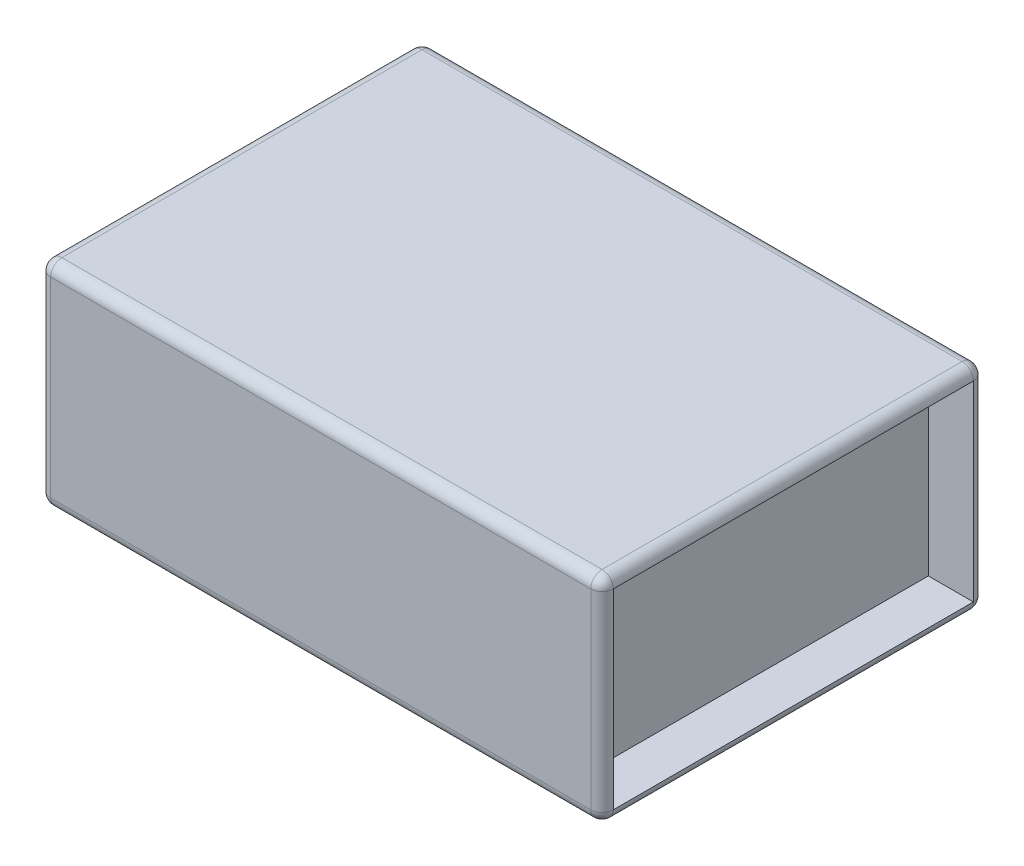
ISO-10303-21;
HEADER;
FILE_DESCRIPTION(('STEP AP214'),'2;1');
FILE_NAME('part.step','',(''),(''),'','','');
FILE_SCHEMA(('AUTOMOTIVE_DESIGN { 1 0 10303 214 1 1 1 1 }'));
ENDSEC;
DATA;
#1=APPLICATION_CONTEXT('core data for automotive mechanical design processes');
#2=APPLICATION_PROTOCOL_DEFINITION('international standard','automotive_design',2000,#1);
#3=PRODUCT_CONTEXT('',#1,'mechanical');
#4=PRODUCT('Part','Part','',(#3));
#5=PRODUCT_RELATED_PRODUCT_CATEGORY('part','',(#4));
#6=PRODUCT_DEFINITION_FORMATION('','',#4);
#7=PRODUCT_DEFINITION_CONTEXT('part definition',#1,'design');
#8=PRODUCT_DEFINITION('design','',#6,#7);
#9=PRODUCT_DEFINITION_SHAPE('','',#8);
#10=(LENGTH_UNIT() NAMED_UNIT(*) SI_UNIT(.MILLI.,.METRE.));
#11=(NAMED_UNIT(*) PLANE_ANGLE_UNIT() SI_UNIT($,.RADIAN.));
#12=(NAMED_UNIT(*) SI_UNIT($,.STERADIAN.) SOLID_ANGLE_UNIT());
#13=UNCERTAINTY_MEASURE_WITH_UNIT(LENGTH_MEASURE(1.E-05),#10,'distance_accuracy_value','');
#14=(GEOMETRIC_REPRESENTATION_CONTEXT(3) GLOBAL_UNCERTAINTY_ASSIGNED_CONTEXT((#13)) GLOBAL_UNIT_ASSIGNED_CONTEXT((#10,
#11,#12)) REPRESENTATION_CONTEXT('',''));
#15=CARTESIAN_POINT('',(0.,0.,0.));
#16=DIRECTION('',(0.,0.,1.));
#17=DIRECTION('',(1.,0.,0.));
#18=AXIS2_PLACEMENT_3D('',#15,#16,#17);
#19=CARTESIAN_POINT('',(-25.,19.,-17.));
#20=DIRECTION('',(0.,0.,1.));
#21=DIRECTION('',(1.,0.,0.));
#22=AXIS2_PLACEMENT_3D('',#19,#20,#21);
#23=PLANE('',#22);
#24=DIRECTION('',(-1.,0.,0.));
#25=VECTOR('',#24,1.);
#26=CARTESIAN_POINT('',(-25.,1.,-17.));
#27=LINE('',#26,#25);
#28=CARTESIAN_POINT('',(24.,1.,-17.));
#29=VERTEX_POINT('',#28);
#30=CARTESIAN_POINT('',(-24.,1.,-17.));
#31=VERTEX_POINT('',#30);
#32=EDGE_CURVE('E208',#29,#31,#27,.T.);
#33=ORIENTED_EDGE('',*,*,#32,.T.);
#34=DIRECTION('',(0.,-1.,0.));
#35=VECTOR('',#34,1.);
#36=CARTESIAN_POINT('',(-24.,19.,-17.));
#37=LINE('',#36,#35);
#38=CARTESIAN_POINT('',(-24.,18.,-17.));
#39=VERTEX_POINT('',#38);
#40=EDGE_CURVE('E44',#31,#39,#37,.F.);
#41=ORIENTED_EDGE('',*,*,#40,.T.);
#42=DIRECTION('',(-1.,0.,0.));
#43=VECTOR('',#42,1.);
#44=CARTESIAN_POINT('',(25.,18.,-17.));
#45=LINE('',#44,#43);
#46=CARTESIAN_POINT('',(24.,18.,-17.));
#47=VERTEX_POINT('',#46);
#48=EDGE_CURVE('E206',#39,#47,#45,.F.);
#49=ORIENTED_EDGE('',*,*,#48,.T.);
#50=DIRECTION('',(0.,-1.,0.));
#51=VECTOR('',#50,1.);
#52=CARTESIAN_POINT('',(24.,19.,-17.));
#53=LINE('',#52,#51);
#54=EDGE_CURVE('E204',#47,#29,#53,.T.);
#55=ORIENTED_EDGE('',*,*,#54,.T.);
#56=EDGE_LOOP('',(#33,#41,#49,#55));
#57=FACE_BOUND('',#56,.T.);
#58=ADVANCED_FACE('F35',(#57),#23,.F.);
#59=CARTESIAN_POINT('',(-25.,19.,-17.));
#60=DIRECTION('',(1.,0.,0.));
#61=DIRECTION('',(0.,0.,-1.));
#62=AXIS2_PLACEMENT_3D('',#59,#60,#61);
#63=PLANE('',#62);
#64=DIRECTION('',(0.,0.,1.));
#65=VECTOR('',#64,1.);
#66=CARTESIAN_POINT('',(-25.,18.,-17.));
#67=LINE('',#66,#65);
#68=CARTESIAN_POINT('',(-25.,18.,16.));
#69=VERTEX_POINT('',#68);
#70=CARTESIAN_POINT('',(-25.,18.,-16.));
#71=VERTEX_POINT('',#70);
#72=EDGE_CURVE('E178',#69,#71,#67,.F.);
#73=ORIENTED_EDGE('',*,*,#72,.T.);
#74=DIRECTION('',(0.,-1.,0.));
#75=VECTOR('',#74,1.);
#76=CARTESIAN_POINT('',(-25.,19.,-16.));
#77=LINE('',#76,#75);
#78=CARTESIAN_POINT('',(-25.,1.,-16.));
#79=VERTEX_POINT('',#78);
#80=EDGE_CURVE('E276',#71,#79,#77,.T.);
#81=ORIENTED_EDGE('',*,*,#80,.T.);
#82=DIRECTION('',(0.,0.,1.));
#83=VECTOR('',#82,1.);
#84=CARTESIAN_POINT('',(-25.,1.,-17.));
#85=LINE('',#84,#83);
#86=CARTESIAN_POINT('',(-25.,1.,16.));
#87=VERTEX_POINT('',#86);
#88=EDGE_CURVE('E185',#79,#87,#85,.T.);
#89=ORIENTED_EDGE('',*,*,#88,.T.);
#90=DIRECTION('',(0.,-1.,0.));
#91=VECTOR('',#90,1.);
#92=CARTESIAN_POINT('',(-25.,19.,16.));
#93=LINE('',#92,#91);
#94=EDGE_CURVE('E274',#87,#69,#93,.F.);
#95=ORIENTED_EDGE('',*,*,#94,.T.);
#96=EDGE_LOOP('',(#73,#81,#89,#95));
#97=FACE_BOUND('',#96,.T.);
#98=ADVANCED_FACE('F344',(#97),#63,.F.);
#99=CARTESIAN_POINT('',(-25.,19.,17.));
#100=DIRECTION('',(0.,0.,-1.));
#101=DIRECTION('',(-1.,0.,0.));
#102=AXIS2_PLACEMENT_3D('',#99,#100,#101);
#103=PLANE('',#102);
#104=DIRECTION('',(1.,0.,0.));
#105=VECTOR('',#104,1.);
#106=CARTESIAN_POINT('',(-25.,18.,17.));
#107=LINE('',#106,#105);
#108=CARTESIAN_POINT('',(24.,18.,17.));
#109=VERTEX_POINT('',#108);
#110=CARTESIAN_POINT('',(-24.,18.,17.));
#111=VERTEX_POINT('',#110);
#112=EDGE_CURVE('E200',#109,#111,#107,.F.);
#113=ORIENTED_EDGE('',*,*,#112,.T.);
#114=DIRECTION('',(0.,-1.,0.));
#115=VECTOR('',#114,1.);
#116=CARTESIAN_POINT('',(-24.,19.,17.));
#117=LINE('',#116,#115);
#118=CARTESIAN_POINT('',(-24.,1.,17.));
#119=VERTEX_POINT('',#118);
#120=EDGE_CURVE('E11',#111,#119,#117,.T.);
#121=ORIENTED_EDGE('',*,*,#120,.T.);
#122=DIRECTION('',(1.,0.,0.));
#123=VECTOR('',#122,1.);
#124=CARTESIAN_POINT('',(-25.,1.,17.));
#125=LINE('',#124,#123);
#126=CARTESIAN_POINT('',(24.,1.,17.));
#127=VERTEX_POINT('',#126);
#128=EDGE_CURVE('E202',#119,#127,#125,.T.);
#129=ORIENTED_EDGE('',*,*,#128,.T.);
#130=DIRECTION('',(0.,-1.,0.));
#131=VECTOR('',#130,1.);
#132=CARTESIAN_POINT('',(24.,19.,17.));
#133=LINE('',#132,#131);
#134=EDGE_CURVE('E198',#127,#109,#133,.F.);
#135=ORIENTED_EDGE('',*,*,#134,.T.);
#136=EDGE_LOOP('',(#113,#121,#129,#135));
#137=FACE_BOUND('',#136,.T.);
#138=ADVANCED_FACE('F350',(#137),#103,.F.);
#139=CARTESIAN_POINT('',(0.,19.,0.));
#140=DIRECTION('',(0.,1.,0.));
#141=DIRECTION('',(0.,0.,1.));
#142=AXIS2_PLACEMENT_3D('',#139,#140,#141);
#143=PLANE('',#142);
#144=DIRECTION('',(-1.,0.,0.));
#145=VECTOR('',#144,1.);
#146=CARTESIAN_POINT('',(-25.,19.,-16.));
#147=LINE('',#146,#145);
#148=CARTESIAN_POINT('',(24.,19.,-16.));
#149=VERTEX_POINT('',#148);
#150=CARTESIAN_POINT('',(-24.,19.,-16.));
#151=VERTEX_POINT('',#150);
#152=EDGE_CURVE('E213',#149,#151,#147,.T.);
#153=ORIENTED_EDGE('',*,*,#152,.T.);
#154=DIRECTION('',(0.,0.,1.));
#155=VECTOR('',#154,1.);
#156=CARTESIAN_POINT('',(-24.,19.,17.));
#157=LINE('',#156,#155);
#158=CARTESIAN_POINT('',(-24.,19.,16.));
#159=VERTEX_POINT('',#158);
#160=EDGE_CURVE('E218',#151,#159,#157,.T.);
#161=ORIENTED_EDGE('',*,*,#160,.T.);
#162=DIRECTION('',(1.,0.,0.));
#163=VECTOR('',#162,1.);
#164=CARTESIAN_POINT('',(25.,19.,16.));
#165=LINE('',#164,#163);
#166=CARTESIAN_POINT('',(24.,19.,16.));
#167=VERTEX_POINT('',#166);
#168=EDGE_CURVE('E216',#159,#167,#165,.T.);
#169=ORIENTED_EDGE('',*,*,#168,.T.);
#170=DIRECTION('',(0.,0.,-1.));
#171=VECTOR('',#170,1.);
#172=CARTESIAN_POINT('',(24.,19.,-17.));
#173=LINE('',#172,#171);
#174=EDGE_CURVE('E211',#167,#149,#173,.T.);
#175=ORIENTED_EDGE('',*,*,#174,.T.);
#176=EDGE_LOOP('',(#153,#161,#169,#175));
#177=FACE_BOUND('',#176,.T.);
#178=ADVANCED_FACE('F561',(#177),#143,.T.);
#179=CARTESIAN_POINT('',(0.,0.,0.));
#180=DIRECTION('',(0.,1.,0.));
#181=DIRECTION('',(0.,0.,1.));
#182=AXIS2_PLACEMENT_3D('',#179,#180,#181);
#183=PLANE('',#182);
#184=DIRECTION('',(1.,0.,0.));
#185=VECTOR('',#184,1.);
#186=CARTESIAN_POINT('',(0.,0.,16.));
#187=LINE('',#186,#185);
#188=CARTESIAN_POINT('',(24.,0.,16.));
#189=VERTEX_POINT('',#188);
#190=CARTESIAN_POINT('',(-24.,0.,16.));
#191=VERTEX_POINT('',#190);
#192=EDGE_CURVE('E192',#189,#191,#187,.F.);
#193=ORIENTED_EDGE('',*,*,#192,.T.);
#194=DIRECTION('',(0.,0.,1.));
#195=VECTOR('',#194,1.);
#196=CARTESIAN_POINT('',(-24.,0.,0.));
#197=LINE('',#196,#195);
#198=CARTESIAN_POINT('',(-24.,0.,-16.));
#199=VERTEX_POINT('',#198);
#200=EDGE_CURVE('E195',#191,#199,#197,.F.);
#201=ORIENTED_EDGE('',*,*,#200,.T.);
#202=DIRECTION('',(-1.,0.,0.));
#203=VECTOR('',#202,1.);
#204=CARTESIAN_POINT('',(0.,0.,-16.));
#205=LINE('',#204,#203);
#206=CARTESIAN_POINT('',(24.,0.,-16.));
#207=VERTEX_POINT('',#206);
#208=EDGE_CURVE('E190',#199,#207,#205,.F.);
#209=ORIENTED_EDGE('',*,*,#208,.T.);
#210=DIRECTION('',(0.,0.,-1.));
#211=VECTOR('',#210,1.);
#212=CARTESIAN_POINT('',(24.,0.,0.));
#213=LINE('',#212,#211);
#214=EDGE_CURVE('E188',#207,#189,#213,.F.);
#215=ORIENTED_EDGE('',*,*,#214,.T.);
#216=EDGE_LOOP('',(#193,#201,#209,#215));
#217=FACE_BOUND('',#216,.T.);
#218=ADVANCED_FACE('F296',(#217),#183,.F.);
#219=CARTESIAN_POINT('',(21.,18.,-16.));
#220=DIRECTION('',(0.,1.,0.));
#221=DIRECTION('',(0.,0.,1.));
#222=AXIS2_PLACEMENT_3D('',#219,#220,#221);
#223=PLANE('',#222);
#224=DIRECTION('',(0.,0.,1.));
#225=VECTOR('',#224,1.);
#226=CARTESIAN_POINT('',(25.,18.,-16.));
#227=LINE('',#226,#225);
#228=CARTESIAN_POINT('',(25.,18.,-16.));
#229=VERTEX_POINT('',#228);
#230=CARTESIAN_POINT('',(25.,18.,16.));
#231=VERTEX_POINT('',#230);
#232=EDGE_CURVE('E145',#229,#231,#227,.T.);
#233=ORIENTED_EDGE('',*,*,#232,.T.);
#234=DIRECTION('',(1.,0.,0.));
#235=VECTOR('',#234,1.);
#236=CARTESIAN_POINT('',(21.,18.,16.));
#237=LINE('',#236,#235);
#238=CARTESIAN_POINT('',(21.,18.,16.));
#239=VERTEX_POINT('',#238);
#240=EDGE_CURVE('E138',#239,#231,#237,.T.);
#241=ORIENTED_EDGE('',*,*,#240,.F.);
#242=DIRECTION('',(0.,0.,1.));
#243=VECTOR('',#242,1.);
#244=CARTESIAN_POINT('',(21.,18.,-16.));
#245=LINE('',#244,#243);
#246=CARTESIAN_POINT('',(21.,18.,-16.));
#247=VERTEX_POINT('',#246);
#248=EDGE_CURVE('E142',#247,#239,#245,.T.);
#249=ORIENTED_EDGE('',*,*,#248,.F.);
#250=DIRECTION('',(1.,0.,0.));
#251=VECTOR('',#250,1.);
#252=CARTESIAN_POINT('',(21.,18.,-16.));
#253=LINE('',#252,#251);
#254=EDGE_CURVE('E176',#247,#229,#253,.T.);
#255=ORIENTED_EDGE('',*,*,#254,.T.);
#256=EDGE_LOOP('',(#233,#241,#249,#255));
#257=FACE_BOUND('',#256,.T.);
#258=ADVANCED_FACE('F140',(#257),#223,.F.);
#259=CARTESIAN_POINT('',(21.,1.,-16.));
#260=DIRECTION('',(0.,0.,-1.));
#261=DIRECTION('',(-1.,0.,0.));
#262=AXIS2_PLACEMENT_3D('',#259,#260,#261);
#263=PLANE('',#262);
#264=DIRECTION('',(0.,1.,0.));
#265=VECTOR('',#264,1.);
#266=CARTESIAN_POINT('',(25.,1.,-16.));
#267=LINE('',#266,#265);
#268=CARTESIAN_POINT('',(25.,1.,-16.));
#269=VERTEX_POINT('',#268);
#270=EDGE_CURVE('E162',#269,#229,#267,.T.);
#271=ORIENTED_EDGE('',*,*,#270,.T.);
#272=ORIENTED_EDGE('',*,*,#254,.F.);
#273=DIRECTION('',(0.,1.,0.));
#274=VECTOR('',#273,1.);
#275=CARTESIAN_POINT('',(21.,1.,-16.));
#276=LINE('',#275,#274);
#277=CARTESIAN_POINT('',(21.,1.,-16.));
#278=VERTEX_POINT('',#277);
#279=EDGE_CURVE('E150',#278,#247,#276,.T.);
#280=ORIENTED_EDGE('',*,*,#279,.F.);
#281=DIRECTION('',(1.,0.,0.));
#282=VECTOR('',#281,1.);
#283=CARTESIAN_POINT('',(21.,1.,-16.));
#284=LINE('',#283,#282);
#285=EDGE_CURVE('E179',#278,#269,#284,.T.);
#286=ORIENTED_EDGE('',*,*,#285,.T.);
#287=EDGE_LOOP('',(#271,#272,#280,#286));
#288=FACE_BOUND('',#287,.T.);
#289=ADVANCED_FACE('F325',(#288),#263,.F.);
#290=CARTESIAN_POINT('',(21.,1.,16.));
#291=DIRECTION('',(0.,-1.,0.));
#292=DIRECTION('',(0.,0.,-1.));
#293=AXIS2_PLACEMENT_3D('',#290,#291,#292);
#294=PLANE('',#293);
#295=DIRECTION('',(0.,0.,-1.));
#296=VECTOR('',#295,1.);
#297=CARTESIAN_POINT('',(25.,1.,16.));
#298=LINE('',#297,#296);
#299=CARTESIAN_POINT('',(25.,1.,16.));
#300=VERTEX_POINT('',#299);
#301=EDGE_CURVE('E165',#300,#269,#298,.T.);
#302=ORIENTED_EDGE('',*,*,#301,.T.);
#303=ORIENTED_EDGE('',*,*,#285,.F.);
#304=DIRECTION('',(0.,0.,-1.));
#305=VECTOR('',#304,1.);
#306=CARTESIAN_POINT('',(21.,1.,16.));
#307=LINE('',#306,#305);
#308=CARTESIAN_POINT('',(21.,1.,16.));
#309=VERTEX_POINT('',#308);
#310=EDGE_CURVE('E158',#309,#278,#307,.T.);
#311=ORIENTED_EDGE('',*,*,#310,.F.);
#312=DIRECTION('',(1.,0.,0.));
#313=VECTOR('',#312,1.);
#314=CARTESIAN_POINT('',(21.,1.,16.));
#315=LINE('',#314,#313);
#316=EDGE_CURVE('E149',#309,#300,#315,.T.);
#317=ORIENTED_EDGE('',*,*,#316,.T.);
#318=EDGE_LOOP('',(#302,#303,#311,#317));
#319=FACE_BOUND('',#318,.T.);
#320=ADVANCED_FACE('F327',(#319),#294,.F.);
#321=CARTESIAN_POINT('',(21.,18.,16.));
#322=DIRECTION('',(0.,0.,1.));
#323=DIRECTION('',(1.,0.,0.));
#324=AXIS2_PLACEMENT_3D('',#321,#322,#323);
#325=PLANE('',#324);
#326=DIRECTION('',(0.,-1.,0.));
#327=VECTOR('',#326,1.);
#328=CARTESIAN_POINT('',(25.,18.,16.));
#329=LINE('',#328,#327);
#330=EDGE_CURVE('E171',#231,#300,#329,.T.);
#331=ORIENTED_EDGE('',*,*,#330,.T.);
#332=ORIENTED_EDGE('',*,*,#316,.F.);
#333=DIRECTION('',(0.,-1.,0.));
#334=VECTOR('',#333,1.);
#335=CARTESIAN_POINT('',(21.,18.,16.));
#336=LINE('',#335,#334);
#337=EDGE_CURVE('E153',#239,#309,#336,.T.);
#338=ORIENTED_EDGE('',*,*,#337,.F.);
#339=ORIENTED_EDGE('',*,*,#240,.T.);
#340=EDGE_LOOP('',(#331,#332,#338,#339));
#341=FACE_BOUND('',#340,.T.);
#342=ADVANCED_FACE('F154',(#341),#325,.F.);
#343=CARTESIAN_POINT('',(21.,0.,0.));
#344=DIRECTION('',(1.,0.,0.));
#345=DIRECTION('',(0.,0.,-1.));
#346=AXIS2_PLACEMENT_3D('',#343,#344,#345);
#347=PLANE('',#346);
#348=ORIENTED_EDGE('',*,*,#248,.T.);
#349=ORIENTED_EDGE('',*,*,#337,.T.);
#350=ORIENTED_EDGE('',*,*,#310,.T.);
#351=ORIENTED_EDGE('',*,*,#279,.T.);
#352=EDGE_LOOP('',(#348,#349,#350,#351));
#353=FACE_BOUND('',#352,.T.);
#354=ADVANCED_FACE('F160',(#353),#347,.T.);
#355=CARTESIAN_POINT('',(-24.,18.,0.));
#356=DIRECTION('',(0.,0.,-1.));
#357=DIRECTION('',(-1.,0.,0.));
#358=AXIS2_PLACEMENT_3D('',#355,#356,#357);
#359=CYLINDRICAL_SURFACE('',#358,1.);
#360=ORIENTED_EDGE('',*,*,#160,.F.);
#361=CARTESIAN_POINT('',(-24.,18.,-16.));
#362=DIRECTION('',(0.,0.,-1.));
#363=DIRECTION('',(-1.,0.,0.));
#364=AXIS2_PLACEMENT_3D('',#361,#362,#363);
#365=CIRCLE('',#364,1.);
#366=EDGE_CURVE('E261',#151,#71,#365,.F.);
#367=ORIENTED_EDGE('',*,*,#366,.T.);
#368=ORIENTED_EDGE('',*,*,#72,.F.);
#369=CARTESIAN_POINT('',(-24.,18.,16.));
#370=DIRECTION('',(0.,0.,-1.));
#371=DIRECTION('',(-1.,0.,0.));
#372=AXIS2_PLACEMENT_3D('',#369,#370,#371);
#373=CIRCLE('',#372,1.);
#374=EDGE_CURVE('E259',#69,#159,#373,.T.);
#375=ORIENTED_EDGE('',*,*,#374,.T.);
#376=EDGE_LOOP('',(#360,#367,#368,#375));
#377=FACE_BOUND('',#376,.T.);
#378=ADVANCED_FACE('F510',(#377),#359,.T.);
#379=CARTESIAN_POINT('',(0.,18.,-16.));
#380=DIRECTION('',(1.,0.,0.));
#381=DIRECTION('',(0.,0.,-1.));
#382=AXIS2_PLACEMENT_3D('',#379,#380,#381);
#383=CYLINDRICAL_SURFACE('',#382,1.);
#384=ORIENTED_EDGE('',*,*,#48,.F.);
#385=CARTESIAN_POINT('',(-24.,18.,-16.));
#386=DIRECTION('',(1.,0.,0.));
#387=DIRECTION('',(0.,0.,-1.));
#388=AXIS2_PLACEMENT_3D('',#385,#386,#387);
#389=CIRCLE('',#388,1.);
#390=EDGE_CURVE('E221',#39,#151,#389,.T.);
#391=ORIENTED_EDGE('',*,*,#390,.T.);
#392=ORIENTED_EDGE('',*,*,#152,.F.);
#393=CARTESIAN_POINT('',(24.,18.,-16.));
#394=DIRECTION('',(1.,0.,0.));
#395=DIRECTION('',(0.,0.,-1.));
#396=AXIS2_PLACEMENT_3D('',#393,#394,#395);
#397=CIRCLE('',#396,1.);
#398=EDGE_CURVE('E252',#47,#149,#397,.T.);
#399=ORIENTED_EDGE('',*,*,#398,.F.);
#400=EDGE_LOOP('',(#384,#391,#392,#399));
#401=FACE_BOUND('',#400,.T.);
#402=ADVANCED_FACE('F501',(#401),#383,.T.);
#403=CARTESIAN_POINT('',(0.,18.,16.));
#404=DIRECTION('',(-1.,0.,0.));
#405=DIRECTION('',(0.,0.,1.));
#406=AXIS2_PLACEMENT_3D('',#403,#404,#405);
#407=CYLINDRICAL_SURFACE('',#406,1.);
#408=ORIENTED_EDGE('',*,*,#168,.F.);
#409=CARTESIAN_POINT('',(-24.,18.,16.));
#410=DIRECTION('',(-1.,0.,0.));
#411=DIRECTION('',(0.,0.,1.));
#412=AXIS2_PLACEMENT_3D('',#409,#410,#411);
#413=CIRCLE('',#412,1.);
#414=EDGE_CURVE('E269',#159,#111,#413,.F.);
#415=ORIENTED_EDGE('',*,*,#414,.T.);
#416=ORIENTED_EDGE('',*,*,#112,.F.);
#417=CARTESIAN_POINT('',(24.,18.,16.));
#418=DIRECTION('',(1.,0.,0.));
#419=DIRECTION('',(0.,0.,-1.));
#420=AXIS2_PLACEMENT_3D('',#417,#418,#419);
#421=CIRCLE('',#420,1.);
#422=EDGE_CURVE('E249',#167,#109,#421,.T.);
#423=ORIENTED_EDGE('',*,*,#422,.F.);
#424=EDGE_LOOP('',(#408,#415,#416,#423));
#425=FACE_BOUND('',#424,.T.);
#426=ADVANCED_FACE('F492',(#425),#407,.T.);
#427=CARTESIAN_POINT('',(24.,18.,0.));
#428=DIRECTION('',(0.,0.,1.));
#429=DIRECTION('',(1.,0.,0.));
#430=AXIS2_PLACEMENT_3D('',#427,#428,#429);
#431=CYLINDRICAL_SURFACE('',#430,1.);
#432=CARTESIAN_POINT('',(24.,18.,-16.));
#433=DIRECTION('',(0.,0.,-1.));
#434=DIRECTION('',(-1.,0.,0.));
#435=AXIS2_PLACEMENT_3D('',#432,#433,#434);
#436=CIRCLE('',#435,1.);
#437=EDGE_CURVE('E172',#149,#229,#436,.T.);
#438=ORIENTED_EDGE('',*,*,#437,.F.);
#439=ORIENTED_EDGE('',*,*,#174,.F.);
#440=CARTESIAN_POINT('',(24.,18.,16.));
#441=DIRECTION('',(0.,0.,1.));
#442=DIRECTION('',(1.,0.,0.));
#443=AXIS2_PLACEMENT_3D('',#440,#441,#442);
#444=CIRCLE('',#443,1.);
#445=EDGE_CURVE('E246',#231,#167,#444,.T.);
#446=ORIENTED_EDGE('',*,*,#445,.F.);
#447=ORIENTED_EDGE('',*,*,#232,.F.);
#448=EDGE_LOOP('',(#438,#439,#446,#447));
#449=FACE_BOUND('',#448,.T.);
#450=ADVANCED_FACE('F483',(#449),#431,.T.);
#451=CARTESIAN_POINT('',(24.,18.,-16.));
#452=DIRECTION('',(0.,0.,1.));
#453=DIRECTION('',(1.,0.,0.));
#454=AXIS2_PLACEMENT_3D('',#451,#452,#453);
#455=SPHERICAL_SURFACE('',#454,1.);
#456=ORIENTED_EDGE('',*,*,#398,.T.);
#457=ORIENTED_EDGE('',*,*,#437,.T.);
#458=CARTESIAN_POINT('',(24.,18.,-16.));
#459=DIRECTION('',(0.,1.,0.));
#460=DIRECTION('',(0.,0.,1.));
#461=AXIS2_PLACEMENT_3D('',#458,#459,#460);
#462=CIRCLE('',#461,1.);
#463=EDGE_CURVE('E243',#47,#229,#462,.F.);
#464=ORIENTED_EDGE('',*,*,#463,.F.);
#465=EDGE_LOOP('',(#456,#457,#464));
#466=FACE_BOUND('',#465,.T.);
#467=ADVANCED_FACE('F474',(#466),#455,.T.);
#468=CARTESIAN_POINT('',(24.,18.,16.));
#469=DIRECTION('',(0.,0.,1.));
#470=DIRECTION('',(1.,0.,0.));
#471=AXIS2_PLACEMENT_3D('',#468,#469,#470);
#472=SPHERICAL_SURFACE('',#471,1.);
#473=ORIENTED_EDGE('',*,*,#445,.T.);
#474=ORIENTED_EDGE('',*,*,#422,.T.);
#475=CARTESIAN_POINT('',(24.,18.,16.));
#476=DIRECTION('',(0.,1.,0.));
#477=DIRECTION('',(0.,0.,1.));
#478=AXIS2_PLACEMENT_3D('',#475,#476,#477);
#479=CIRCLE('',#478,1.);
#480=EDGE_CURVE('E240',#231,#109,#479,.F.);
#481=ORIENTED_EDGE('',*,*,#480,.F.);
#482=EDGE_LOOP('',(#473,#474,#481));
#483=FACE_BOUND('',#482,.T.);
#484=ADVANCED_FACE('F466',(#483),#472,.T.);
#485=CARTESIAN_POINT('',(24.,19.,-16.));
#486=DIRECTION('',(0.,-1.,0.));
#487=DIRECTION('',(0.,0.,-1.));
#488=AXIS2_PLACEMENT_3D('',#485,#486,#487);
#489=CYLINDRICAL_SURFACE('',#488,1.);
#490=ORIENTED_EDGE('',*,*,#463,.T.);
#491=ORIENTED_EDGE('',*,*,#270,.F.);
#492=CARTESIAN_POINT('',(24.,1.,-16.));
#493=DIRECTION('',(0.,-1.,0.));
#494=DIRECTION('',(0.,0.,-1.));
#495=AXIS2_PLACEMENT_3D('',#492,#493,#494);
#496=CIRCLE('',#495,1.);
#497=EDGE_CURVE('E235',#29,#269,#496,.T.);
#498=ORIENTED_EDGE('',*,*,#497,.F.);
#499=ORIENTED_EDGE('',*,*,#54,.F.);
#500=EDGE_LOOP('',(#490,#491,#498,#499));
#501=FACE_BOUND('',#500,.T.);
#502=ADVANCED_FACE('F322',(#501),#489,.T.);
#503=CARTESIAN_POINT('',(24.,19.,16.));
#504=DIRECTION('',(0.,-1.,0.));
#505=DIRECTION('',(0.,0.,-1.));
#506=AXIS2_PLACEMENT_3D('',#503,#504,#505);
#507=CYLINDRICAL_SURFACE('',#506,1.);
#508=ORIENTED_EDGE('',*,*,#480,.T.);
#509=ORIENTED_EDGE('',*,*,#134,.F.);
#510=CARTESIAN_POINT('',(24.,1.,16.));
#511=DIRECTION('',(0.,-1.,0.));
#512=DIRECTION('',(0.,0.,-1.));
#513=AXIS2_PLACEMENT_3D('',#510,#511,#512);
#514=CIRCLE('',#513,1.);
#515=EDGE_CURVE('E232',#300,#127,#514,.T.);
#516=ORIENTED_EDGE('',*,*,#515,.F.);
#517=ORIENTED_EDGE('',*,*,#330,.F.);
#518=EDGE_LOOP('',(#508,#509,#516,#517));
#519=FACE_BOUND('',#518,.T.);
#520=ADVANCED_FACE('F332',(#519),#507,.T.);
#521=CARTESIAN_POINT('',(24.,1.,-17.));
#522=DIRECTION('',(0.,0.,-1.));
#523=DIRECTION('',(-1.,0.,0.));
#524=AXIS2_PLACEMENT_3D('',#521,#522,#523);
#525=CYLINDRICAL_SURFACE('',#524,1.);
#526=CARTESIAN_POINT('',(24.,1.,-16.));
#527=DIRECTION('',(0.,0.,-1.));
#528=DIRECTION('',(-1.,0.,0.));
#529=AXIS2_PLACEMENT_3D('',#526,#527,#528);
#530=CIRCLE('',#529,1.);
#531=EDGE_CURVE('E237',#269,#207,#530,.T.);
#532=ORIENTED_EDGE('',*,*,#531,.F.);
#533=ORIENTED_EDGE('',*,*,#301,.F.);
#534=CARTESIAN_POINT('',(24.,1.,16.));
#535=DIRECTION('',(0.,0.,1.));
#536=DIRECTION('',(1.,0.,0.));
#537=AXIS2_PLACEMENT_3D('',#534,#535,#536);
#538=CIRCLE('',#537,1.);
#539=EDGE_CURVE('E229',#189,#300,#538,.T.);
#540=ORIENTED_EDGE('',*,*,#539,.F.);
#541=ORIENTED_EDGE('',*,*,#214,.F.);
#542=EDGE_LOOP('',(#532,#533,#540,#541));
#543=FACE_BOUND('',#542,.T.);
#544=ADVANCED_FACE('F313',(#543),#525,.T.);
#545=CARTESIAN_POINT('',(24.,1.,-16.));
#546=DIRECTION('',(0.,0.,1.));
#547=DIRECTION('',(1.,0.,0.));
#548=AXIS2_PLACEMENT_3D('',#545,#546,#547);
#549=SPHERICAL_SURFACE('',#548,1.);
#550=ORIENTED_EDGE('',*,*,#497,.T.);
#551=ORIENTED_EDGE('',*,*,#531,.T.);
#552=CARTESIAN_POINT('',(24.,1.,-16.));
#553=DIRECTION('',(1.,0.,0.));
#554=DIRECTION('',(0.,0.,-1.));
#555=AXIS2_PLACEMENT_3D('',#552,#553,#554);
#556=CIRCLE('',#555,1.);
#557=EDGE_CURVE('E225',#29,#207,#556,.F.);
#558=ORIENTED_EDGE('',*,*,#557,.F.);
#559=EDGE_LOOP('',(#550,#551,#558));
#560=FACE_BOUND('',#559,.T.);
#561=ADVANCED_FACE('F318',(#560),#549,.T.);
#562=CARTESIAN_POINT('',(24.,1.,16.));
#563=DIRECTION('',(0.,0.,1.));
#564=DIRECTION('',(1.,0.,0.));
#565=AXIS2_PLACEMENT_3D('',#562,#563,#564);
#566=SPHERICAL_SURFACE('',#565,1.);
#567=ORIENTED_EDGE('',*,*,#539,.T.);
#568=ORIENTED_EDGE('',*,*,#515,.T.);
#569=CARTESIAN_POINT('',(24.,1.,16.));
#570=DIRECTION('',(1.,0.,0.));
#571=DIRECTION('',(0.,0.,-1.));
#572=AXIS2_PLACEMENT_3D('',#569,#570,#571);
#573=CIRCLE('',#572,1.);
#574=EDGE_CURVE('E222',#189,#127,#573,.F.);
#575=ORIENTED_EDGE('',*,*,#574,.F.);
#576=EDGE_LOOP('',(#567,#568,#575));
#577=FACE_BOUND('',#576,.T.);
#578=ADVANCED_FACE('F334',(#577),#566,.T.);
#579=CARTESIAN_POINT('',(-25.,1.,-16.));
#580=DIRECTION('',(-1.,0.,0.));
#581=DIRECTION('',(0.,0.,1.));
#582=AXIS2_PLACEMENT_3D('',#579,#580,#581);
#583=CYLINDRICAL_SURFACE('',#582,1.);
#584=ORIENTED_EDGE('',*,*,#208,.F.);
#585=CARTESIAN_POINT('',(-24.,1.,-16.));
#586=DIRECTION('',(-1.,0.,0.));
#587=DIRECTION('',(0.,0.,1.));
#588=AXIS2_PLACEMENT_3D('',#585,#586,#587);
#589=CIRCLE('',#588,1.);
#590=EDGE_CURVE('E267',#199,#31,#589,.F.);
#591=ORIENTED_EDGE('',*,*,#590,.T.);
#592=ORIENTED_EDGE('',*,*,#32,.F.);
#593=ORIENTED_EDGE('',*,*,#557,.T.);
#594=EDGE_LOOP('',(#584,#591,#592,#593));
#595=FACE_BOUND('',#594,.T.);
#596=ADVANCED_FACE('F308',(#595),#583,.T.);
#597=CARTESIAN_POINT('',(-25.,1.,16.));
#598=DIRECTION('',(1.,0.,0.));
#599=DIRECTION('',(0.,0.,-1.));
#600=AXIS2_PLACEMENT_3D('',#597,#598,#599);
#601=CYLINDRICAL_SURFACE('',#600,1.);
#602=ORIENTED_EDGE('',*,*,#128,.F.);
#603=CARTESIAN_POINT('',(-24.,1.,16.));
#604=DIRECTION('',(1.,0.,0.));
#605=DIRECTION('',(0.,0.,-1.));
#606=AXIS2_PLACEMENT_3D('',#603,#604,#605);
#607=CIRCLE('',#606,1.);
#608=EDGE_CURVE('E272',#119,#191,#607,.T.);
#609=ORIENTED_EDGE('',*,*,#608,.T.);
#610=ORIENTED_EDGE('',*,*,#192,.F.);
#611=ORIENTED_EDGE('',*,*,#574,.T.);
#612=EDGE_LOOP('',(#602,#609,#610,#611));
#613=FACE_BOUND('',#612,.T.);
#614=ADVANCED_FACE('F293',(#613),#601,.T.);
#615=CARTESIAN_POINT('',(-24.,1.,-17.));
#616=DIRECTION('',(0.,0.,1.));
#617=DIRECTION('',(1.,0.,0.));
#618=AXIS2_PLACEMENT_3D('',#615,#616,#617);
#619=CYLINDRICAL_SURFACE('',#618,1.);
#620=ORIENTED_EDGE('',*,*,#88,.F.);
#621=CARTESIAN_POINT('',(-24.,1.,-16.));
#622=DIRECTION('',(0.,0.,1.));
#623=DIRECTION('',(1.,0.,0.));
#624=AXIS2_PLACEMENT_3D('',#621,#622,#623);
#625=CIRCLE('',#624,1.);
#626=EDGE_CURVE('E265',#79,#199,#625,.T.);
#627=ORIENTED_EDGE('',*,*,#626,.T.);
#628=ORIENTED_EDGE('',*,*,#200,.F.);
#629=CARTESIAN_POINT('',(-24.,1.,16.));
#630=DIRECTION('',(0.,0.,1.));
#631=DIRECTION('',(1.,0.,0.));
#632=AXIS2_PLACEMENT_3D('',#629,#630,#631);
#633=CIRCLE('',#632,1.);
#634=EDGE_CURVE('E263',#191,#87,#633,.F.);
#635=ORIENTED_EDGE('',*,*,#634,.T.);
#636=EDGE_LOOP('',(#620,#627,#628,#635));
#637=FACE_BOUND('',#636,.T.);
#638=ADVANCED_FACE('F302',(#637),#619,.T.);
#639=CARTESIAN_POINT('',(-24.,1.,-16.));
#640=DIRECTION('',(0.,0.,1.));
#641=DIRECTION('',(1.,0.,0.));
#642=AXIS2_PLACEMENT_3D('',#639,#640,#641);
#643=SPHERICAL_SURFACE('',#642,1.);
#644=ORIENTED_EDGE('',*,*,#590,.F.);
#645=ORIENTED_EDGE('',*,*,#626,.F.);
#646=CARTESIAN_POINT('',(-24.,1.,-16.));
#647=DIRECTION('',(0.,1.,0.));
#648=DIRECTION('',(0.,0.,1.));
#649=AXIS2_PLACEMENT_3D('',#646,#647,#648);
#650=CIRCLE('',#649,1.);
#651=EDGE_CURVE('E226',#31,#79,#650,.T.);
#652=ORIENTED_EDGE('',*,*,#651,.F.);
#653=EDGE_LOOP('',(#644,#645,#652));
#654=FACE_BOUND('',#653,.T.);
#655=ADVANCED_FACE('F357',(#654),#643,.T.);
#656=CARTESIAN_POINT('',(-24.,19.,-16.));
#657=DIRECTION('',(0.,-1.,0.));
#658=DIRECTION('',(0.,0.,-1.));
#659=AXIS2_PLACEMENT_3D('',#656,#657,#658);
#660=CYLINDRICAL_SURFACE('',#659,1.);
#661=ORIENTED_EDGE('',*,*,#651,.T.);
#662=ORIENTED_EDGE('',*,*,#80,.F.);
#663=CARTESIAN_POINT('',(-24.,18.,-16.));
#664=DIRECTION('',(0.,1.,0.));
#665=DIRECTION('',(0.,0.,1.));
#666=AXIS2_PLACEMENT_3D('',#663,#664,#665);
#667=CIRCLE('',#666,1.);
#668=EDGE_CURVE('E279',#39,#71,#667,.T.);
#669=ORIENTED_EDGE('',*,*,#668,.F.);
#670=ORIENTED_EDGE('',*,*,#40,.F.);
#671=EDGE_LOOP('',(#661,#662,#669,#670));
#672=FACE_BOUND('',#671,.T.);
#673=ADVANCED_FACE('F373',(#672),#660,.T.);
#674=CARTESIAN_POINT('',(-24.,18.,-16.));
#675=DIRECTION('',(0.,0.,1.));
#676=DIRECTION('',(1.,0.,0.));
#677=AXIS2_PLACEMENT_3D('',#674,#675,#676);
#678=SPHERICAL_SURFACE('',#677,1.);
#679=ORIENTED_EDGE('',*,*,#668,.T.);
#680=ORIENTED_EDGE('',*,*,#366,.F.);
#681=ORIENTED_EDGE('',*,*,#390,.F.);
#682=EDGE_LOOP('',(#679,#680,#681));
#683=FACE_BOUND('',#682,.T.);
#684=ADVANCED_FACE('F380',(#683),#678,.T.);
#685=CARTESIAN_POINT('',(-24.,1.,16.));
#686=DIRECTION('',(0.,0.,1.));
#687=DIRECTION('',(1.,0.,0.));
#688=AXIS2_PLACEMENT_3D('',#685,#686,#687);
#689=SPHERICAL_SURFACE('',#688,1.);
#690=ORIENTED_EDGE('',*,*,#634,.F.);
#691=ORIENTED_EDGE('',*,*,#608,.F.);
#692=CARTESIAN_POINT('',(-24.,1.,16.));
#693=DIRECTION('',(0.,1.,0.));
#694=DIRECTION('',(0.,0.,1.));
#695=AXIS2_PLACEMENT_3D('',#692,#693,#694);
#696=CIRCLE('',#695,1.);
#697=EDGE_CURVE('E39',#87,#119,#696,.T.);
#698=ORIENTED_EDGE('',*,*,#697,.F.);
#699=EDGE_LOOP('',(#690,#691,#698));
#700=FACE_BOUND('',#699,.T.);
#701=ADVANCED_FACE('F37',(#700),#689,.T.);
#702=CARTESIAN_POINT('',(-24.,19.,16.));
#703=DIRECTION('',(0.,-1.,0.));
#704=DIRECTION('',(0.,0.,-1.));
#705=AXIS2_PLACEMENT_3D('',#702,#703,#704);
#706=CYLINDRICAL_SURFACE('',#705,1.);
#707=ORIENTED_EDGE('',*,*,#697,.T.);
#708=ORIENTED_EDGE('',*,*,#120,.F.);
#709=CARTESIAN_POINT('',(-24.,18.,16.));
#710=DIRECTION('',(0.,1.,0.));
#711=DIRECTION('',(0.,0.,1.));
#712=AXIS2_PLACEMENT_3D('',#709,#710,#711);
#713=CIRCLE('',#712,1.);
#714=EDGE_CURVE('E58',#69,#111,#713,.T.);
#715=ORIENTED_EDGE('',*,*,#714,.F.);
#716=ORIENTED_EDGE('',*,*,#94,.F.);
#717=EDGE_LOOP('',(#707,#708,#715,#716));
#718=FACE_BOUND('',#717,.T.);
#719=ADVANCED_FACE('F287',(#718),#706,.T.);
#720=CARTESIAN_POINT('',(-24.,18.,16.));
#721=DIRECTION('',(0.,0.,1.));
#722=DIRECTION('',(1.,0.,0.));
#723=AXIS2_PLACEMENT_3D('',#720,#721,#722);
#724=SPHERICAL_SURFACE('',#723,1.);
#725=ORIENTED_EDGE('',*,*,#414,.F.);
#726=ORIENTED_EDGE('',*,*,#374,.F.);
#727=ORIENTED_EDGE('',*,*,#714,.T.);
#728=EDGE_LOOP('',(#725,#726,#727));
#729=FACE_BOUND('',#728,.T.);
#730=ADVANCED_FACE('F400',(#729),#724,.T.);
#731=CLOSED_SHELL('',(#58,#98,#138,#178,#218,#258,#289,#320,#342,#354,#378,#402,#426,#450,#467,
#484,#502,#520,#544,#561,#578,#596,#614,#638,#655,#673,#684,#701,#719,#730));
#732=MANIFOLD_SOLID_BREP('B2',#731);
#733=ADVANCED_BREP_SHAPE_REPRESENTATION('',(#18,#732),#14);
#734=SHAPE_DEFINITION_REPRESENTATION(#9,#733);
ENDSEC;
END-ISO-10303-21;
